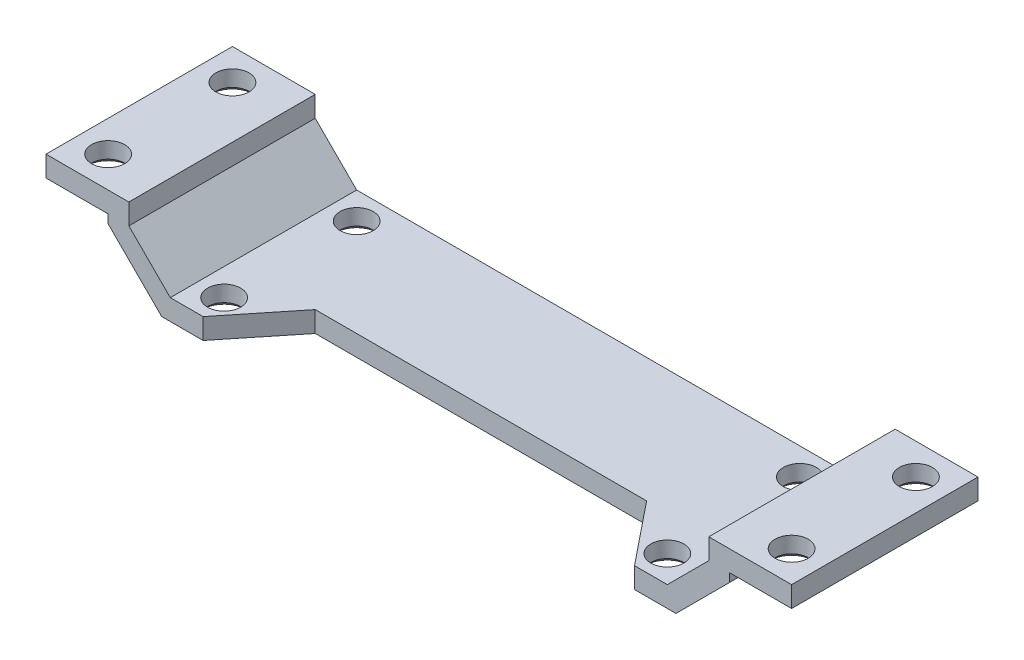
ISO-10303-21;
HEADER;
FILE_DESCRIPTION(('STEP AP214'),'2;1');
FILE_NAME('part.step','',(''),(''),'','','');
FILE_SCHEMA(('AUTOMOTIVE_DESIGN { 1 0 10303 214 1 1 1 1 }'));
ENDSEC;
DATA;
#1=APPLICATION_CONTEXT('core data for automotive mechanical design processes');
#2=APPLICATION_PROTOCOL_DEFINITION('international standard','automotive_design',2000,#1);
#3=PRODUCT_CONTEXT('',#1,'mechanical');
#4=PRODUCT('Part','Part','',(#3));
#5=PRODUCT_RELATED_PRODUCT_CATEGORY('part','',(#4));
#6=PRODUCT_DEFINITION_FORMATION('','',#4);
#7=PRODUCT_DEFINITION_CONTEXT('part definition',#1,'design');
#8=PRODUCT_DEFINITION('design','',#6,#7);
#9=PRODUCT_DEFINITION_SHAPE('','',#8);
#10=(LENGTH_UNIT() NAMED_UNIT(*) SI_UNIT(.MILLI.,.METRE.));
#11=(NAMED_UNIT(*) PLANE_ANGLE_UNIT() SI_UNIT($,.RADIAN.));
#12=(NAMED_UNIT(*) SI_UNIT($,.STERADIAN.) SOLID_ANGLE_UNIT());
#13=UNCERTAINTY_MEASURE_WITH_UNIT(LENGTH_MEASURE(1.E-05),#10,'distance_accuracy_value','');
#14=(GEOMETRIC_REPRESENTATION_CONTEXT(3) GLOBAL_UNCERTAINTY_ASSIGNED_CONTEXT((#13)) GLOBAL_UNIT_ASSIGNED_CONTEXT((#10,
#11,#12)) REPRESENTATION_CONTEXT('',''));
#15=CARTESIAN_POINT('',(0.,0.,0.));
#16=DIRECTION('',(0.,0.,1.));
#17=DIRECTION('',(1.,0.,0.));
#18=AXIS2_PLACEMENT_3D('',#15,#16,#17);
#19=CARTESIAN_POINT('',(-12.4142135623731,-1.,9.));
#20=DIRECTION('',(0.,1.,0.));
#21=DIRECTION('',(0.,0.,1.));
#22=AXIS2_PLACEMENT_3D('',#19,#20,#21);
#23=PLANE('',#22);
#24=CARTESIAN_POINT('',(-10.7,-1.,1.3));
#25=DIRECTION('',(0.,-1.,0.));
#26=DIRECTION('',(0.,0.,-1.));
#27=AXIS2_PLACEMENT_3D('',#24,#25,#26);
#28=CIRCLE('',#27,1.025);
#29=CARTESIAN_POINT('',(-10.7,-1.,0.275000000000001));
#30=VERTEX_POINT('',#29);
#31=EDGE_CURVE('E757',#30,#30,#28,.T.);
#32=ORIENTED_EDGE('',*,*,#31,.F.);
#33=EDGE_LOOP('',(#32));
#34=FACE_BOUND('',#33,.T.);
#35=CARTESIAN_POINT('',(10.7,-1.,7.7));
#36=DIRECTION('',(0.,-1.,0.));
#37=DIRECTION('',(0.,0.,-1.));
#38=AXIS2_PLACEMENT_3D('',#35,#36,#37);
#39=CIRCLE('',#38,1.025);
#40=CARTESIAN_POINT('',(10.7,-1.,6.675));
#41=VERTEX_POINT('',#40);
#42=EDGE_CURVE('E775',#41,#41,#39,.T.);
#43=ORIENTED_EDGE('',*,*,#42,.F.);
#44=EDGE_LOOP('',(#43));
#45=FACE_BOUND('',#44,.T.);
#46=DIRECTION('',(1.,0.,0.));
#47=VECTOR('',#46,1.);
#48=CARTESIAN_POINT('',(-12.4142135623731,-1.,9.));
#49=LINE('',#48,#47);
#50=CARTESIAN_POINT('',(10.4142135623731,-1.,9.));
#51=VERTEX_POINT('',#50);
#52=CARTESIAN_POINT('',(12.4142135623731,-1.,9.));
#53=VERTEX_POINT('',#52);
#54=EDGE_CURVE('E273',#51,#53,#49,.T.);
#55=ORIENTED_EDGE('',*,*,#54,.F.);
#56=DIRECTION('',(0.62694312132195,0.,0.779065031064218));
#57=VECTOR('',#56,1.);
#58=CARTESIAN_POINT('',(8.,-1.,6.));
#59=LINE('',#58,#57);
#60=CARTESIAN_POINT('',(8.,-1.,6.));
#61=VERTEX_POINT('',#60);
#62=EDGE_CURVE('E286',#61,#51,#59,.T.);
#63=ORIENTED_EDGE('',*,*,#62,.F.);
#64=DIRECTION('',(1.,0.,0.));
#65=VECTOR('',#64,1.);
#66=CARTESIAN_POINT('',(-8.,-1.,6.));
#67=LINE('',#66,#65);
#68=CARTESIAN_POINT('',(-8.,-1.,6.));
#69=VERTEX_POINT('',#68);
#70=EDGE_CURVE('E821',#69,#61,#67,.T.);
#71=ORIENTED_EDGE('',*,*,#70,.F.);
#72=DIRECTION('',(0.626943121321951,0.,-0.779065031064218));
#73=VECTOR('',#72,1.);
#74=CARTESIAN_POINT('',(-10.4142135623731,-1.,9.));
#75=LINE('',#74,#73);
#76=CARTESIAN_POINT('',(-10.4142135623731,-1.,9.));
#77=VERTEX_POINT('',#76);
#78=EDGE_CURVE('E351',#77,#69,#75,.T.);
#79=ORIENTED_EDGE('',*,*,#78,.F.);
#80=CARTESIAN_POINT('',(-12.4142135623731,-1.,9.));
#81=VERTEX_POINT('',#80);
#82=EDGE_CURVE('E288',#81,#77,#49,.T.);
#83=ORIENTED_EDGE('',*,*,#82,.F.);
#84=DIRECTION('',(0.,0.,-1.));
#85=VECTOR('',#84,1.);
#86=CARTESIAN_POINT('',(-12.4142135623731,-1.,9.));
#87=LINE('',#86,#85);
#88=CARTESIAN_POINT('',(-12.4142135623731,-1.,0.));
#89=VERTEX_POINT('',#88);
#90=EDGE_CURVE('E248',#81,#89,#87,.T.);
#91=ORIENTED_EDGE('',*,*,#90,.T.);
#92=DIRECTION('',(1.,0.,0.));
#93=VECTOR('',#92,1.);
#94=CARTESIAN_POINT('',(-12.4142135623731,-1.,0.));
#95=LINE('',#94,#93);
#96=CARTESIAN_POINT('',(12.4142135623731,-1.,0.));
#97=VERTEX_POINT('',#96);
#98=EDGE_CURVE('E213',#89,#97,#95,.T.);
#99=ORIENTED_EDGE('',*,*,#98,.T.);
#100=DIRECTION('',(0.,0.,-1.));
#101=VECTOR('',#100,1.);
#102=CARTESIAN_POINT('',(12.4142135623731,-1.,9.));
#103=LINE('',#102,#101);
#104=EDGE_CURVE('E245',#53,#97,#103,.T.);
#105=ORIENTED_EDGE('',*,*,#104,.F.);
#106=EDGE_LOOP('',(#55,#63,#71,#79,#83,#91,#99,#105));
#107=FACE_BOUND('',#106,.T.);
#108=CARTESIAN_POINT('',(10.7,-1.,1.3));
#109=DIRECTION('',(0.,-1.,0.));
#110=DIRECTION('',(0.,0.,-1.));
#111=AXIS2_PLACEMENT_3D('',#108,#109,#110);
#112=CIRCLE('',#111,1.025);
#113=CARTESIAN_POINT('',(10.7,-1.,0.275000000000004));
#114=VERTEX_POINT('',#113);
#115=EDGE_CURVE('E766',#114,#114,#112,.T.);
#116=ORIENTED_EDGE('',*,*,#115,.F.);
#117=EDGE_LOOP('',(#116));
#118=FACE_BOUND('',#117,.T.);
#119=CARTESIAN_POINT('',(-10.7,-1.,7.7));
#120=DIRECTION('',(0.,-1.,0.));
#121=DIRECTION('',(0.,0.,-1.));
#122=AXIS2_PLACEMENT_3D('',#119,#120,#121);
#123=CIRCLE('',#122,1.025);
#124=CARTESIAN_POINT('',(-10.7,-1.,6.675));
#125=VERTEX_POINT('',#124);
#126=EDGE_CURVE('E749',#125,#125,#123,.T.);
#127=ORIENTED_EDGE('',*,*,#126,.F.);
#128=EDGE_LOOP('',(#127));
#129=FACE_BOUND('',#128,.T.);
#130=ADVANCED_FACE('F36',(#34,#45,#107,#118,#129),#23,.F.);
#131=CARTESIAN_POINT('',(0.,0.,9.));
#132=DIRECTION('',(0.,0.,-1.));
#133=DIRECTION('',(-1.,0.,0.));
#134=AXIS2_PLACEMENT_3D('',#131,#132,#133);
#135=PLANE('',#134);
#136=DIRECTION('',(-1.,0.,0.));
#137=VECTOR('',#136,1.);
#138=CARTESIAN_POINT('',(-12.,0.,9.));
#139=LINE('',#138,#137);
#140=CARTESIAN_POINT('',(12.,0.,9.));
#141=VERTEX_POINT('',#140);
#142=CARTESIAN_POINT('',(10.4142135623731,0.,9.));
#143=VERTEX_POINT('',#142);
#144=EDGE_CURVE('E192',#141,#143,#139,.T.);
#145=ORIENTED_EDGE('',*,*,#144,.T.);
#146=DIRECTION('',(0.,-1.,0.));
#147=VECTOR('',#146,1.);
#148=CARTESIAN_POINT('',(10.4142135623731,0.,9.));
#149=LINE('',#148,#147);
#150=EDGE_CURVE('E44',#143,#51,#149,.T.);
#151=ORIENTED_EDGE('',*,*,#150,.T.);
#152=ORIENTED_EDGE('',*,*,#54,.T.);
#153=DIRECTION('',(0.707106781186548,0.707106781186547,0.));
#154=VECTOR('',#153,1.);
#155=CARTESIAN_POINT('',(12.4142135623731,-1.,9.));
#156=LINE('',#155,#154);
#157=CARTESIAN_POINT('',(15.,1.58578643762691,9.));
#158=VERTEX_POINT('',#157);
#159=EDGE_CURVE('E292',#53,#158,#156,.T.);
#160=ORIENTED_EDGE('',*,*,#159,.T.);
#161=DIRECTION('',(0.,1.,0.));
#162=VECTOR('',#161,1.);
#163=CARTESIAN_POINT('',(15.,1.58578643762691,9.));
#164=LINE('',#163,#162);
#165=CARTESIAN_POINT('',(15.,2.,9.));
#166=VERTEX_POINT('',#165);
#167=EDGE_CURVE('E298',#158,#166,#164,.T.);
#168=ORIENTED_EDGE('',*,*,#167,.T.);
#169=DIRECTION('',(1.,0.,0.));
#170=VECTOR('',#169,1.);
#171=CARTESIAN_POINT('',(15.,2.,9.));
#172=LINE('',#171,#170);
#173=CARTESIAN_POINT('',(18.,2.,9.));
#174=VERTEX_POINT('',#173);
#175=EDGE_CURVE('E300',#166,#174,#172,.T.);
#176=ORIENTED_EDGE('',*,*,#175,.T.);
#177=DIRECTION('',(0.,1.,0.));
#178=VECTOR('',#177,1.);
#179=CARTESIAN_POINT('',(18.,2.,9.));
#180=LINE('',#179,#178);
#181=CARTESIAN_POINT('',(18.,3.,9.));
#182=VERTEX_POINT('',#181);
#183=EDGE_CURVE('E302',#174,#182,#180,.T.);
#184=ORIENTED_EDGE('',*,*,#183,.T.);
#185=DIRECTION('',(-1.,0.,0.));
#186=VECTOR('',#185,1.);
#187=CARTESIAN_POINT('',(14.,3.,9.));
#188=LINE('',#187,#186);
#189=CARTESIAN_POINT('',(14.,3.,9.));
#190=VERTEX_POINT('',#189);
#191=EDGE_CURVE('E174',#182,#190,#188,.T.);
#192=ORIENTED_EDGE('',*,*,#191,.T.);
#193=DIRECTION('',(0.,-1.,0.));
#194=VECTOR('',#193,1.);
#195=CARTESIAN_POINT('',(14.,2.,9.));
#196=LINE('',#195,#194);
#197=CARTESIAN_POINT('',(14.,2.,9.));
#198=VERTEX_POINT('',#197);
#199=EDGE_CURVE('E166',#190,#198,#196,.T.);
#200=ORIENTED_EDGE('',*,*,#199,.T.);
#201=DIRECTION('',(-0.707106781186548,-0.707106781186547,0.));
#202=VECTOR('',#201,1.);
#203=CARTESIAN_POINT('',(12.,0.,9.));
#204=LINE('',#203,#202);
#205=EDGE_CURVE('E171',#198,#141,#204,.T.);
#206=ORIENTED_EDGE('',*,*,#205,.T.);
#207=EDGE_LOOP('',(#145,#151,#152,#160,#168,#176,#184,#192,#200,#206));
#208=FACE_BOUND('',#207,.T.);
#209=ADVANCED_FACE('F169',(#208),#135,.F.);
#210=CARTESIAN_POINT('',(-12.,0.,9.));
#211=DIRECTION('',(-0.707106781186548,-0.707106781186547,0.));
#212=DIRECTION('',(0.707106781186547,-0.707106781186548,0.));
#213=AXIS2_PLACEMENT_3D('',#210,#211,#212);
#214=PLANE('',#213);
#215=DIRECTION('',(-0.707106781186547,0.707106781186548,0.));
#216=VECTOR('',#215,1.);
#217=CARTESIAN_POINT('',(-12.,0.,0.));
#218=LINE('',#217,#216);
#219=CARTESIAN_POINT('',(-12.,0.,0.));
#220=VERTEX_POINT('',#219);
#221=CARTESIAN_POINT('',(-14.,2.,0.));
#222=VERTEX_POINT('',#221);
#223=EDGE_CURVE('E197',#220,#222,#218,.T.);
#224=ORIENTED_EDGE('',*,*,#223,.T.);
#225=DIRECTION('',(0.,0.,-1.));
#226=VECTOR('',#225,1.);
#227=CARTESIAN_POINT('',(-14.,2.,9.));
#228=LINE('',#227,#226);
#229=CARTESIAN_POINT('',(-14.,2.,9.));
#230=VERTEX_POINT('',#229);
#231=EDGE_CURVE('E266',#230,#222,#228,.T.);
#232=ORIENTED_EDGE('',*,*,#231,.F.);
#233=DIRECTION('',(-0.707106781186547,0.707106781186548,0.));
#234=VECTOR('',#233,1.);
#235=CARTESIAN_POINT('',(-12.,0.,9.));
#236=LINE('',#235,#234);
#237=CARTESIAN_POINT('',(-12.,0.,9.));
#238=VERTEX_POINT('',#237);
#239=EDGE_CURVE('E229',#238,#230,#236,.T.);
#240=ORIENTED_EDGE('',*,*,#239,.F.);
#241=DIRECTION('',(0.,0.,-1.));
#242=VECTOR('',#241,1.);
#243=CARTESIAN_POINT('',(-12.,0.,9.));
#244=LINE('',#243,#242);
#245=EDGE_CURVE('E196',#238,#220,#244,.T.);
#246=ORIENTED_EDGE('',*,*,#245,.T.);
#247=EDGE_LOOP('',(#224,#232,#240,#246));
#248=FACE_BOUND('',#247,.T.);
#249=ADVANCED_FACE('F38',(#248),#214,.F.);
#250=CARTESIAN_POINT('',(-14.,2.,9.));
#251=DIRECTION('',(-1.,0.,0.));
#252=DIRECTION('',(0.,0.,1.));
#253=AXIS2_PLACEMENT_3D('',#250,#251,#252);
#254=PLANE('',#253);
#255=DIRECTION('',(0.,1.,0.));
#256=VECTOR('',#255,1.);
#257=CARTESIAN_POINT('',(-14.,2.,0.));
#258=LINE('',#257,#256);
#259=CARTESIAN_POINT('',(-14.,3.,0.));
#260=VERTEX_POINT('',#259);
#261=EDGE_CURVE('E200',#222,#260,#258,.T.);
#262=ORIENTED_EDGE('',*,*,#261,.T.);
#263=DIRECTION('',(0.,0.,-1.));
#264=VECTOR('',#263,1.);
#265=CARTESIAN_POINT('',(-14.,3.,9.));
#266=LINE('',#265,#264);
#267=CARTESIAN_POINT('',(-14.,3.,9.));
#268=VERTEX_POINT('',#267);
#269=EDGE_CURVE('E263',#268,#260,#266,.T.);
#270=ORIENTED_EDGE('',*,*,#269,.F.);
#271=DIRECTION('',(0.,1.,0.));
#272=VECTOR('',#271,1.);
#273=CARTESIAN_POINT('',(-14.,2.,9.));
#274=LINE('',#273,#272);
#275=EDGE_CURVE('E126',#230,#268,#274,.T.);
#276=ORIENTED_EDGE('',*,*,#275,.F.);
#277=ORIENTED_EDGE('',*,*,#231,.T.);
#278=EDGE_LOOP('',(#262,#270,#276,#277));
#279=FACE_BOUND('',#278,.T.);
#280=ADVANCED_FACE('F368',(#279),#254,.F.);
#281=CARTESIAN_POINT('',(-14.,3.,9.));
#282=DIRECTION('',(0.,-1.,0.));
#283=DIRECTION('',(1.,0.,0.));
#284=AXIS2_PLACEMENT_3D('',#281,#282,#283);
#285=PLANE('',#284);
#286=CARTESIAN_POINT('',(-16.5,3.,7.5));
#287=DIRECTION('',(0.,-1.,0.));
#288=DIRECTION('',(1.,0.,0.));
#289=AXIS2_PLACEMENT_3D('',#286,#287,#288);
#290=CIRCLE('',#289,0.799999999999993);
#291=CARTESIAN_POINT('',(-15.7,3.,7.5));
#292=VERTEX_POINT('',#291);
#293=EDGE_CURVE('E790',#292,#292,#290,.T.);
#294=ORIENTED_EDGE('',*,*,#293,.T.);
#295=EDGE_LOOP('',(#294));
#296=FACE_BOUND('',#295,.T.);
#297=CARTESIAN_POINT('',(-16.5,3.,1.5));
#298=DIRECTION('',(0.,-1.,0.));
#299=DIRECTION('',(1.,0.,0.));
#300=AXIS2_PLACEMENT_3D('',#297,#298,#299);
#301=CIRCLE('',#300,0.799999999999993);
#302=CARTESIAN_POINT('',(-15.7,3.,1.5));
#303=VERTEX_POINT('',#302);
#304=EDGE_CURVE('E799',#303,#303,#301,.T.);
#305=ORIENTED_EDGE('',*,*,#304,.T.);
#306=EDGE_LOOP('',(#305));
#307=FACE_BOUND('',#306,.T.);
#308=DIRECTION('',(-1.,0.,0.));
#309=VECTOR('',#308,1.);
#310=CARTESIAN_POINT('',(-14.,3.,0.));
#311=LINE('',#310,#309);
#312=CARTESIAN_POINT('',(-18.,3.,0.));
#313=VERTEX_POINT('',#312);
#314=EDGE_CURVE('E203',#260,#313,#311,.T.);
#315=ORIENTED_EDGE('',*,*,#314,.T.);
#316=DIRECTION('',(0.,0.,-1.));
#317=VECTOR('',#316,1.);
#318=CARTESIAN_POINT('',(-18.,3.,9.));
#319=LINE('',#318,#317);
#320=CARTESIAN_POINT('',(-18.,3.,9.));
#321=VERTEX_POINT('',#320);
#322=EDGE_CURVE('E260',#321,#313,#319,.T.);
#323=ORIENTED_EDGE('',*,*,#322,.F.);
#324=DIRECTION('',(-1.,0.,0.));
#325=VECTOR('',#324,1.);
#326=CARTESIAN_POINT('',(-14.,3.,9.));
#327=LINE('',#326,#325);
#328=EDGE_CURVE('E328',#268,#321,#327,.T.);
#329=ORIENTED_EDGE('',*,*,#328,.F.);
#330=ORIENTED_EDGE('',*,*,#269,.T.);
#331=EDGE_LOOP('',(#315,#323,#329,#330));
#332=FACE_BOUND('',#331,.T.);
#333=ADVANCED_FACE('F371',(#296,#307,#332),#285,.F.);
#334=CARTESIAN_POINT('',(-18.,3.,9.));
#335=DIRECTION('',(1.,0.,0.));
#336=DIRECTION('',(0.,0.,-1.));
#337=AXIS2_PLACEMENT_3D('',#334,#335,#336);
#338=PLANE('',#337);
#339=DIRECTION('',(0.,-1.,0.));
#340=VECTOR('',#339,1.);
#341=CARTESIAN_POINT('',(-18.,3.,0.));
#342=LINE('',#341,#340);
#343=CARTESIAN_POINT('',(-18.,2.,0.));
#344=VERTEX_POINT('',#343);
#345=EDGE_CURVE('E205',#313,#344,#342,.T.);
#346=ORIENTED_EDGE('',*,*,#345,.T.);
#347=DIRECTION('',(0.,0.,-1.));
#348=VECTOR('',#347,1.);
#349=CARTESIAN_POINT('',(-18.,2.,9.));
#350=LINE('',#349,#348);
#351=CARTESIAN_POINT('',(-18.,2.,9.));
#352=VERTEX_POINT('',#351);
#353=EDGE_CURVE('E257',#352,#344,#350,.T.);
#354=ORIENTED_EDGE('',*,*,#353,.F.);
#355=DIRECTION('',(0.,-1.,0.));
#356=VECTOR('',#355,1.);
#357=CARTESIAN_POINT('',(-18.,3.,9.));
#358=LINE('',#357,#356);
#359=EDGE_CURVE('E330',#321,#352,#358,.T.);
#360=ORIENTED_EDGE('',*,*,#359,.F.);
#361=ORIENTED_EDGE('',*,*,#322,.T.);
#362=EDGE_LOOP('',(#346,#354,#360,#361));
#363=FACE_BOUND('',#362,.T.);
#364=ADVANCED_FACE('F376',(#363),#338,.F.);
#365=CARTESIAN_POINT('',(-15.,2.,9.));
#366=DIRECTION('',(0.,1.,0.));
#367=DIRECTION('',(-1.,0.,0.));
#368=AXIS2_PLACEMENT_3D('',#365,#366,#367);
#369=PLANE('',#368);
#370=CARTESIAN_POINT('',(-16.5,2.,7.5));
#371=DIRECTION('',(0.,-1.,0.));
#372=DIRECTION('',(0.,0.,-1.));
#373=AXIS2_PLACEMENT_3D('',#370,#371,#372);
#374=CIRCLE('',#373,1.025);
#375=CARTESIAN_POINT('',(-16.5,2.,6.475));
#376=VERTEX_POINT('',#375);
#377=EDGE_CURVE('E784',#376,#376,#374,.T.);
#378=ORIENTED_EDGE('',*,*,#377,.F.);
#379=EDGE_LOOP('',(#378));
#380=FACE_BOUND('',#379,.T.);
#381=CARTESIAN_POINT('',(-16.5,2.,1.5));
#382=DIRECTION('',(0.,-1.,0.));
#383=DIRECTION('',(0.,0.,-1.));
#384=AXIS2_PLACEMENT_3D('',#381,#382,#383);
#385=CIRCLE('',#384,1.025);
#386=CARTESIAN_POINT('',(-16.5,2.,0.475));
#387=VERTEX_POINT('',#386);
#388=EDGE_CURVE('E793',#387,#387,#385,.T.);
#389=ORIENTED_EDGE('',*,*,#388,.F.);
#390=EDGE_LOOP('',(#389));
#391=FACE_BOUND('',#390,.T.);
#392=DIRECTION('',(1.,0.,0.));
#393=VECTOR('',#392,1.);
#394=CARTESIAN_POINT('',(-15.,2.,0.));
#395=LINE('',#394,#393);
#396=CARTESIAN_POINT('',(-15.,2.,0.));
#397=VERTEX_POINT('',#396);
#398=EDGE_CURVE('E207',#344,#397,#395,.T.);
#399=ORIENTED_EDGE('',*,*,#398,.T.);
#400=DIRECTION('',(0.,0.,-1.));
#401=VECTOR('',#400,1.);
#402=CARTESIAN_POINT('',(-15.,2.,9.));
#403=LINE('',#402,#401);
#404=CARTESIAN_POINT('',(-15.,2.,9.));
#405=VERTEX_POINT('',#404);
#406=EDGE_CURVE('E254',#405,#397,#403,.T.);
#407=ORIENTED_EDGE('',*,*,#406,.F.);
#408=DIRECTION('',(1.,0.,0.));
#409=VECTOR('',#408,1.);
#410=CARTESIAN_POINT('',(-15.,2.,9.));
#411=LINE('',#410,#409);
#412=EDGE_CURVE('E332',#352,#405,#411,.T.);
#413=ORIENTED_EDGE('',*,*,#412,.F.);
#414=ORIENTED_EDGE('',*,*,#353,.T.);
#415=EDGE_LOOP('',(#399,#407,#413,#414));
#416=FACE_BOUND('',#415,.T.);
#417=ADVANCED_FACE('F379',(#380,#391,#416),#369,.F.);
#418=CARTESIAN_POINT('',(-15.,1.5857864376269,9.));
#419=DIRECTION('',(1.,0.,0.));
#420=DIRECTION('',(0.,0.,-1.));
#421=AXIS2_PLACEMENT_3D('',#418,#419,#420);
#422=PLANE('',#421);
#423=DIRECTION('',(0.,-1.,0.));
#424=VECTOR('',#423,1.);
#425=CARTESIAN_POINT('',(-15.,1.5857864376269,0.));
#426=LINE('',#425,#424);
#427=CARTESIAN_POINT('',(-15.,1.5857864376269,0.));
#428=VERTEX_POINT('',#427);
#429=EDGE_CURVE('E209',#397,#428,#426,.T.);
#430=ORIENTED_EDGE('',*,*,#429,.T.);
#431=DIRECTION('',(0.,0.,-1.));
#432=VECTOR('',#431,1.);
#433=CARTESIAN_POINT('',(-15.,1.5857864376269,9.));
#434=LINE('',#433,#432);
#435=CARTESIAN_POINT('',(-15.,1.5857864376269,9.));
#436=VERTEX_POINT('',#435);
#437=EDGE_CURVE('E251',#436,#428,#434,.T.);
#438=ORIENTED_EDGE('',*,*,#437,.F.);
#439=DIRECTION('',(0.,-1.,0.));
#440=VECTOR('',#439,1.);
#441=CARTESIAN_POINT('',(-15.,1.5857864376269,9.));
#442=LINE('',#441,#440);
#443=EDGE_CURVE('E293',#405,#436,#442,.T.);
#444=ORIENTED_EDGE('',*,*,#443,.F.);
#445=ORIENTED_EDGE('',*,*,#406,.T.);
#446=EDGE_LOOP('',(#430,#438,#444,#445));
#447=FACE_BOUND('',#446,.T.);
#448=ADVANCED_FACE('F341',(#447),#422,.F.);
#449=CARTESIAN_POINT('',(-12.4142135623731,-1.,9.));
#450=DIRECTION('',(0.707106781186548,0.707106781186547,0.));
#451=DIRECTION('',(-0.707106781186547,0.707106781186548,0.));
#452=AXIS2_PLACEMENT_3D('',#449,#450,#451);
#453=PLANE('',#452);
#454=DIRECTION('',(0.707106781186547,-0.707106781186548,0.));
#455=VECTOR('',#454,1.);
#456=CARTESIAN_POINT('',(-12.4142135623731,-1.,0.));
#457=LINE('',#456,#455);
#458=EDGE_CURVE('E211',#428,#89,#457,.T.);
#459=ORIENTED_EDGE('',*,*,#458,.T.);
#460=ORIENTED_EDGE('',*,*,#90,.F.);
#461=DIRECTION('',(0.707106781186547,-0.707106781186548,0.));
#462=VECTOR('',#461,1.);
#463=CARTESIAN_POINT('',(-12.4142135623731,-1.,9.));
#464=LINE('',#463,#462);
#465=EDGE_CURVE('E289',#436,#81,#464,.T.);
#466=ORIENTED_EDGE('',*,*,#465,.F.);
#467=ORIENTED_EDGE('',*,*,#437,.T.);
#468=EDGE_LOOP('',(#459,#460,#466,#467));
#469=FACE_BOUND('',#468,.T.);
#470=ADVANCED_FACE('F345',(#469),#453,.F.);
#471=CARTESIAN_POINT('',(12.4142135623731,-1.,9.));
#472=DIRECTION('',(-0.707106781186547,0.707106781186548,0.));
#473=DIRECTION('',(-0.707106781186548,-0.707106781186547,0.));
#474=AXIS2_PLACEMENT_3D('',#471,#472,#473);
#475=PLANE('',#474);
#476=DIRECTION('',(0.707106781186548,0.707106781186547,0.));
#477=VECTOR('',#476,1.);
#478=CARTESIAN_POINT('',(12.4142135623731,-1.,0.));
#479=LINE('',#478,#477);
#480=CARTESIAN_POINT('',(15.,1.58578643762691,0.));
#481=VERTEX_POINT('',#480);
#482=EDGE_CURVE('E215',#97,#481,#479,.T.);
#483=ORIENTED_EDGE('',*,*,#482,.T.);
#484=DIRECTION('',(0.,0.,-1.));
#485=VECTOR('',#484,1.);
#486=CARTESIAN_POINT('',(15.,1.58578643762691,9.));
#487=LINE('',#486,#485);
#488=EDGE_CURVE('E242',#158,#481,#487,.T.);
#489=ORIENTED_EDGE('',*,*,#488,.F.);
#490=ORIENTED_EDGE('',*,*,#159,.F.);
#491=ORIENTED_EDGE('',*,*,#104,.T.);
#492=EDGE_LOOP('',(#483,#489,#490,#491));
#493=FACE_BOUND('',#492,.T.);
#494=ADVANCED_FACE('F383',(#493),#475,.F.);
#495=CARTESIAN_POINT('',(15.,1.58578643762691,9.));
#496=DIRECTION('',(-1.,0.,0.));
#497=DIRECTION('',(0.,0.,1.));
#498=AXIS2_PLACEMENT_3D('',#495,#496,#497);
#499=PLANE('',#498);
#500=DIRECTION('',(0.,1.,0.));
#501=VECTOR('',#500,1.);
#502=CARTESIAN_POINT('',(15.,1.58578643762691,0.));
#503=LINE('',#502,#501);
#504=CARTESIAN_POINT('',(15.,2.,0.));
#505=VERTEX_POINT('',#504);
#506=EDGE_CURVE('E217',#481,#505,#503,.T.);
#507=ORIENTED_EDGE('',*,*,#506,.T.);
#508=DIRECTION('',(0.,0.,-1.));
#509=VECTOR('',#508,1.);
#510=CARTESIAN_POINT('',(15.,2.,9.));
#511=LINE('',#510,#509);
#512=EDGE_CURVE('E239',#166,#505,#511,.T.);
#513=ORIENTED_EDGE('',*,*,#512,.F.);
#514=ORIENTED_EDGE('',*,*,#167,.F.);
#515=ORIENTED_EDGE('',*,*,#488,.T.);
#516=EDGE_LOOP('',(#507,#513,#514,#515));
#517=FACE_BOUND('',#516,.T.);
#518=ADVANCED_FACE('F388',(#517),#499,.F.);
#519=CARTESIAN_POINT('',(15.,2.,9.));
#520=DIRECTION('',(0.,1.,0.));
#521=DIRECTION('',(0.,0.,1.));
#522=AXIS2_PLACEMENT_3D('',#519,#520,#521);
#523=PLANE('',#522);
#524=CARTESIAN_POINT('',(16.5,2.,7.5));
#525=DIRECTION('',(0.,-1.,0.));
#526=DIRECTION('',(0.,0.,-1.));
#527=AXIS2_PLACEMENT_3D('',#524,#525,#526);
#528=CIRCLE('',#527,1.025);
#529=CARTESIAN_POINT('',(16.5,2.,6.475));
#530=VERTEX_POINT('',#529);
#531=EDGE_CURVE('E802',#530,#530,#528,.T.);
#532=ORIENTED_EDGE('',*,*,#531,.F.);
#533=EDGE_LOOP('',(#532));
#534=FACE_BOUND('',#533,.T.);
#535=CARTESIAN_POINT('',(16.5,2.,1.5));
#536=DIRECTION('',(0.,-1.,0.));
#537=DIRECTION('',(0.,0.,-1.));
#538=AXIS2_PLACEMENT_3D('',#535,#536,#537);
#539=CIRCLE('',#538,1.025);
#540=CARTESIAN_POINT('',(16.5,2.,0.474999999999998));
#541=VERTEX_POINT('',#540);
#542=EDGE_CURVE('E811',#541,#541,#539,.T.);
#543=ORIENTED_EDGE('',*,*,#542,.F.);
#544=EDGE_LOOP('',(#543));
#545=FACE_BOUND('',#544,.T.);
#546=DIRECTION('',(1.,0.,0.));
#547=VECTOR('',#546,1.);
#548=CARTESIAN_POINT('',(15.,2.,0.));
#549=LINE('',#548,#547);
#550=CARTESIAN_POINT('',(18.,2.,0.));
#551=VERTEX_POINT('',#550);
#552=EDGE_CURVE('E219',#505,#551,#549,.T.);
#553=ORIENTED_EDGE('',*,*,#552,.T.);
#554=DIRECTION('',(0.,0.,-1.));
#555=VECTOR('',#554,1.);
#556=CARTESIAN_POINT('',(18.,2.,9.));
#557=LINE('',#556,#555);
#558=EDGE_CURVE('E236',#174,#551,#557,.T.);
#559=ORIENTED_EDGE('',*,*,#558,.F.);
#560=ORIENTED_EDGE('',*,*,#175,.F.);
#561=ORIENTED_EDGE('',*,*,#512,.T.);
#562=EDGE_LOOP('',(#553,#559,#560,#561));
#563=FACE_BOUND('',#562,.T.);
#564=ADVANCED_FACE('F391',(#534,#545,#563),#523,.F.);
#565=CARTESIAN_POINT('',(18.,2.,9.));
#566=DIRECTION('',(-1.,0.,0.));
#567=DIRECTION('',(0.,0.,1.));
#568=AXIS2_PLACEMENT_3D('',#565,#566,#567);
#569=PLANE('',#568);
#570=DIRECTION('',(0.,1.,0.));
#571=VECTOR('',#570,1.);
#572=CARTESIAN_POINT('',(18.,2.,0.));
#573=LINE('',#572,#571);
#574=CARTESIAN_POINT('',(18.,3.,0.));
#575=VERTEX_POINT('',#574);
#576=EDGE_CURVE('E221',#551,#575,#573,.T.);
#577=ORIENTED_EDGE('',*,*,#576,.T.);
#578=DIRECTION('',(0.,0.,-1.));
#579=VECTOR('',#578,1.);
#580=CARTESIAN_POINT('',(18.,3.,9.));
#581=LINE('',#580,#579);
#582=EDGE_CURVE('E233',#182,#575,#581,.T.);
#583=ORIENTED_EDGE('',*,*,#582,.F.);
#584=ORIENTED_EDGE('',*,*,#183,.F.);
#585=ORIENTED_EDGE('',*,*,#558,.T.);
#586=EDGE_LOOP('',(#577,#583,#584,#585));
#587=FACE_BOUND('',#586,.T.);
#588=ADVANCED_FACE('F308',(#587),#569,.F.);
#589=CARTESIAN_POINT('',(14.,3.,9.));
#590=DIRECTION('',(0.,-1.,0.));
#591=DIRECTION('',(0.,0.,-1.));
#592=AXIS2_PLACEMENT_3D('',#589,#590,#591);
#593=PLANE('',#592);
#594=CARTESIAN_POINT('',(16.5,3.,7.5));
#595=DIRECTION('',(0.,-1.,0.));
#596=DIRECTION('',(0.,0.,-1.));
#597=AXIS2_PLACEMENT_3D('',#594,#595,#596);
#598=CIRCLE('',#597,0.799999999999993);
#599=CARTESIAN_POINT('',(16.5,3.,6.70000000000001));
#600=VERTEX_POINT('',#599);
#601=EDGE_CURVE('E808',#600,#600,#598,.T.);
#602=ORIENTED_EDGE('',*,*,#601,.T.);
#603=EDGE_LOOP('',(#602));
#604=FACE_BOUND('',#603,.T.);
#605=CARTESIAN_POINT('',(16.5,3.,1.5));
#606=DIRECTION('',(0.,-1.,0.));
#607=DIRECTION('',(0.,0.,-1.));
#608=AXIS2_PLACEMENT_3D('',#605,#606,#607);
#609=CIRCLE('',#608,0.799999999999993);
#610=CARTESIAN_POINT('',(16.5,3.,0.700000000000007));
#611=VERTEX_POINT('',#610);
#612=EDGE_CURVE('E817',#611,#611,#609,.T.);
#613=ORIENTED_EDGE('',*,*,#612,.T.);
#614=EDGE_LOOP('',(#613));
#615=FACE_BOUND('',#614,.T.);
#616=DIRECTION('',(-1.,0.,0.));
#617=VECTOR('',#616,1.);
#618=CARTESIAN_POINT('',(14.,3.,0.));
#619=LINE('',#618,#617);
#620=CARTESIAN_POINT('',(14.,3.,0.));
#621=VERTEX_POINT('',#620);
#622=EDGE_CURVE('E223',#575,#621,#619,.T.);
#623=ORIENTED_EDGE('',*,*,#622,.T.);
#624=DIRECTION('',(0.,0.,-1.));
#625=VECTOR('',#624,1.);
#626=CARTESIAN_POINT('',(14.,3.,9.));
#627=LINE('',#626,#625);
#628=EDGE_CURVE('E186',#190,#621,#627,.T.);
#629=ORIENTED_EDGE('',*,*,#628,.F.);
#630=ORIENTED_EDGE('',*,*,#191,.F.);
#631=ORIENTED_EDGE('',*,*,#582,.T.);
#632=EDGE_LOOP('',(#623,#629,#630,#631));
#633=FACE_BOUND('',#632,.T.);
#634=ADVANCED_FACE('F312',(#604,#615,#633),#593,.F.);
#635=CARTESIAN_POINT('',(14.,2.,9.));
#636=DIRECTION('',(1.,0.,0.));
#637=DIRECTION('',(0.,0.,-1.));
#638=AXIS2_PLACEMENT_3D('',#635,#636,#637);
#639=PLANE('',#638);
#640=DIRECTION('',(0.,-1.,0.));
#641=VECTOR('',#640,1.);
#642=CARTESIAN_POINT('',(14.,2.,0.));
#643=LINE('',#642,#641);
#644=CARTESIAN_POINT('',(14.,2.,0.));
#645=VERTEX_POINT('',#644);
#646=EDGE_CURVE('E183',#621,#645,#643,.T.);
#647=ORIENTED_EDGE('',*,*,#646,.T.);
#648=DIRECTION('',(0.,0.,-1.));
#649=VECTOR('',#648,1.);
#650=CARTESIAN_POINT('',(14.,2.,9.));
#651=LINE('',#650,#649);
#652=EDGE_CURVE('E180',#198,#645,#651,.T.);
#653=ORIENTED_EDGE('',*,*,#652,.F.);
#654=ORIENTED_EDGE('',*,*,#199,.F.);
#655=ORIENTED_EDGE('',*,*,#628,.T.);
#656=EDGE_LOOP('',(#647,#653,#654,#655));
#657=FACE_BOUND('',#656,.T.);
#658=ADVANCED_FACE('F181',(#657),#639,.F.);
#659=CARTESIAN_POINT('',(12.,0.,9.));
#660=DIRECTION('',(0.707106781186547,-0.707106781186548,0.));
#661=DIRECTION('',(0.707106781186548,0.707106781186547,0.));
#662=AXIS2_PLACEMENT_3D('',#659,#660,#661);
#663=PLANE('',#662);
#664=DIRECTION('',(-0.707106781186548,-0.707106781186547,0.));
#665=VECTOR('',#664,1.);
#666=CARTESIAN_POINT('',(12.,0.,0.));
#667=LINE('',#666,#665);
#668=CARTESIAN_POINT('',(12.,0.,0.));
#669=VERTEX_POINT('',#668);
#670=EDGE_CURVE('E226',#645,#669,#667,.T.);
#671=ORIENTED_EDGE('',*,*,#670,.T.);
#672=DIRECTION('',(0.,0.,-1.));
#673=VECTOR('',#672,1.);
#674=CARTESIAN_POINT('',(12.,0.,9.));
#675=LINE('',#674,#673);
#676=EDGE_CURVE('E187',#141,#669,#675,.T.);
#677=ORIENTED_EDGE('',*,*,#676,.F.);
#678=ORIENTED_EDGE('',*,*,#205,.F.);
#679=ORIENTED_EDGE('',*,*,#652,.T.);
#680=EDGE_LOOP('',(#671,#677,#678,#679));
#681=FACE_BOUND('',#680,.T.);
#682=ADVANCED_FACE('F189',(#681),#663,.F.);
#683=CARTESIAN_POINT('',(-12.,0.,9.));
#684=DIRECTION('',(0.,-1.,0.));
#685=DIRECTION('',(0.,0.,-1.));
#686=AXIS2_PLACEMENT_3D('',#683,#684,#685);
#687=PLANE('',#686);
#688=CARTESIAN_POINT('',(-10.7,0.,7.7));
#689=DIRECTION('',(0.,-1.,0.));
#690=DIRECTION('',(0.,0.,-1.));
#691=AXIS2_PLACEMENT_3D('',#688,#689,#690);
#692=CIRCLE('',#691,0.799999999999994);
#693=CARTESIAN_POINT('',(-10.7,0.,6.90000000000001));
#694=VERTEX_POINT('',#693);
#695=EDGE_CURVE('E752',#694,#694,#692,.T.);
#696=ORIENTED_EDGE('',*,*,#695,.T.);
#697=EDGE_LOOP('',(#696));
#698=FACE_BOUND('',#697,.T.);
#699=CARTESIAN_POINT('',(-10.7,0.,1.3));
#700=DIRECTION('',(0.,-1.,0.));
#701=DIRECTION('',(0.,0.,-1.));
#702=AXIS2_PLACEMENT_3D('',#699,#700,#701);
#703=CIRCLE('',#702,0.799999999999994);
#704=CARTESIAN_POINT('',(-10.7,0.,0.500000000000007));
#705=VERTEX_POINT('',#704);
#706=EDGE_CURVE('E763',#705,#705,#703,.T.);
#707=ORIENTED_EDGE('',*,*,#706,.T.);
#708=EDGE_LOOP('',(#707));
#709=FACE_BOUND('',#708,.T.);
#710=CARTESIAN_POINT('',(10.7,0.,1.3));
#711=DIRECTION('',(0.,-1.,0.));
#712=DIRECTION('',(0.,0.,-1.));
#713=AXIS2_PLACEMENT_3D('',#710,#711,#712);
#714=CIRCLE('',#713,0.799999999999994);
#715=CARTESIAN_POINT('',(10.7,0.,0.500000000000009));
#716=VERTEX_POINT('',#715);
#717=EDGE_CURVE('E772',#716,#716,#714,.T.);
#718=ORIENTED_EDGE('',*,*,#717,.T.);
#719=EDGE_LOOP('',(#718));
#720=FACE_BOUND('',#719,.T.);
#721=CARTESIAN_POINT('',(10.7,0.,7.7));
#722=DIRECTION('',(0.,-1.,0.));
#723=DIRECTION('',(0.,0.,-1.));
#724=AXIS2_PLACEMENT_3D('',#721,#722,#723);
#725=CIRCLE('',#724,0.799999999999994);
#726=CARTESIAN_POINT('',(10.7,0.,6.90000000000001));
#727=VERTEX_POINT('',#726);
#728=EDGE_CURVE('E781',#727,#727,#725,.T.);
#729=ORIENTED_EDGE('',*,*,#728,.T.);
#730=EDGE_LOOP('',(#729));
#731=FACE_BOUND('',#730,.T.);
#732=DIRECTION('',(1.,0.,0.));
#733=VECTOR('',#732,1.);
#734=CARTESIAN_POINT('',(-12.,0.,6.));
#735=LINE('',#734,#733);
#736=CARTESIAN_POINT('',(-8.,0.,6.));
#737=VERTEX_POINT('',#736);
#738=CARTESIAN_POINT('',(8.,0.,6.));
#739=VERTEX_POINT('',#738);
#740=EDGE_CURVE('E11',#737,#739,#735,.T.);
#741=ORIENTED_EDGE('',*,*,#740,.T.);
#742=DIRECTION('',(0.62694312132195,0.,0.779065031064218));
#743=VECTOR('',#742,1.);
#744=CARTESIAN_POINT('',(1.60413483940636,0.,-1.94776227788238));
#745=LINE('',#744,#743);
#746=EDGE_CURVE('E201',#739,#143,#745,.T.);
#747=ORIENTED_EDGE('',*,*,#746,.T.);
#748=ORIENTED_EDGE('',*,*,#144,.F.);
#749=ORIENTED_EDGE('',*,*,#676,.T.);
#750=DIRECTION('',(-1.,0.,0.));
#751=VECTOR('',#750,1.);
#752=CARTESIAN_POINT('',(-12.,0.,0.));
#753=LINE('',#752,#751);
#754=EDGE_CURVE('E117',#669,#220,#753,.T.);
#755=ORIENTED_EDGE('',*,*,#754,.T.);
#756=ORIENTED_EDGE('',*,*,#245,.F.);
#757=CARTESIAN_POINT('',(-10.4142135623731,0.,9.));
#758=VERTEX_POINT('',#757);
#759=EDGE_CURVE('E59',#758,#238,#139,.T.);
#760=ORIENTED_EDGE('',*,*,#759,.F.);
#761=DIRECTION('',(0.626943121321951,0.,-0.779065031064218));
#762=VECTOR('',#761,1.);
#763=CARTESIAN_POINT('',(-11.0375190963562,0.,9.774544817034));
#764=LINE('',#763,#762);
#765=EDGE_CURVE('E51',#758,#737,#764,.T.);
#766=ORIENTED_EDGE('',*,*,#765,.T.);
#767=EDGE_LOOP('',(#741,#747,#748,#749,#755,#756,#760,#766));
#768=FACE_BOUND('',#767,.T.);
#769=ADVANCED_FACE('F316',(#698,#709,#720,#731,#768),#687,.F.);
#770=ORIENTED_EDGE('',*,*,#82,.T.);
#771=DIRECTION('',(0.,1.,0.));
#772=VECTOR('',#771,1.);
#773=CARTESIAN_POINT('',(-10.4142135623731,0.,9.));
#774=LINE('',#773,#772);
#775=EDGE_CURVE('E268',#77,#758,#774,.T.);
#776=ORIENTED_EDGE('',*,*,#775,.T.);
#777=ORIENTED_EDGE('',*,*,#759,.T.);
#778=ORIENTED_EDGE('',*,*,#239,.T.);
#779=ORIENTED_EDGE('',*,*,#275,.T.);
#780=ORIENTED_EDGE('',*,*,#328,.T.);
#781=ORIENTED_EDGE('',*,*,#359,.T.);
#782=ORIENTED_EDGE('',*,*,#412,.T.);
#783=ORIENTED_EDGE('',*,*,#443,.T.);
#784=ORIENTED_EDGE('',*,*,#465,.T.);
#785=EDGE_LOOP('',(#770,#776,#777,#778,#779,#780,#781,#782,#783,#784));
#786=FACE_BOUND('',#785,.T.);
#787=ADVANCED_FACE('F335',(#786),#135,.F.);
#788=CARTESIAN_POINT('',(0.,0.,0.));
#789=DIRECTION('',(0.,0.,-1.));
#790=DIRECTION('',(-1.,0.,0.));
#791=AXIS2_PLACEMENT_3D('',#788,#789,#790);
#792=PLANE('',#791);
#793=ORIENTED_EDGE('',*,*,#223,.F.);
#794=ORIENTED_EDGE('',*,*,#754,.F.);
#795=ORIENTED_EDGE('',*,*,#670,.F.);
#796=ORIENTED_EDGE('',*,*,#646,.F.);
#797=ORIENTED_EDGE('',*,*,#622,.F.);
#798=ORIENTED_EDGE('',*,*,#576,.F.);
#799=ORIENTED_EDGE('',*,*,#552,.F.);
#800=ORIENTED_EDGE('',*,*,#506,.F.);
#801=ORIENTED_EDGE('',*,*,#482,.F.);
#802=ORIENTED_EDGE('',*,*,#98,.F.);
#803=ORIENTED_EDGE('',*,*,#458,.F.);
#804=ORIENTED_EDGE('',*,*,#429,.F.);
#805=ORIENTED_EDGE('',*,*,#398,.F.);
#806=ORIENTED_EDGE('',*,*,#345,.F.);
#807=ORIENTED_EDGE('',*,*,#314,.F.);
#808=ORIENTED_EDGE('',*,*,#261,.F.);
#809=EDGE_LOOP('',(#793,#794,#795,#796,#797,#798,#799,#800,#801,#802,#803,#804,#805,#806,#807,#808));
#810=FACE_BOUND('',#809,.T.);
#811=ADVANCED_FACE('F315',(#810),#792,.T.);
#812=CARTESIAN_POINT('',(-8.,3.,6.));
#813=DIRECTION('',(0.,0.,-1.));
#814=DIRECTION('',(-1.,0.,0.));
#815=AXIS2_PLACEMENT_3D('',#812,#813,#814);
#816=PLANE('',#815);
#817=DIRECTION('',(0.,-1.,0.));
#818=VECTOR('',#817,1.);
#819=CARTESIAN_POINT('',(-8.,3.,6.));
#820=LINE('',#819,#818);
#821=EDGE_CURVE('E361',#737,#69,#820,.T.);
#822=ORIENTED_EDGE('',*,*,#821,.T.);
#823=ORIENTED_EDGE('',*,*,#70,.T.);
#824=DIRECTION('',(0.,-1.,0.));
#825=VECTOR('',#824,1.);
#826=CARTESIAN_POINT('',(8.,3.,6.));
#827=LINE('',#826,#825);
#828=EDGE_CURVE('E322',#739,#61,#827,.T.);
#829=ORIENTED_EDGE('',*,*,#828,.F.);
#830=ORIENTED_EDGE('',*,*,#740,.F.);
#831=EDGE_LOOP('',(#822,#823,#829,#830));
#832=FACE_BOUND('',#831,.T.);
#833=ADVANCED_FACE('F359',(#832),#816,.F.);
#834=CARTESIAN_POINT('',(8.,3.,6.));
#835=DIRECTION('',(0.779065031064218,0.,-0.62694312132195));
#836=DIRECTION('',(-0.62694312132195,0.,-0.779065031064218));
#837=AXIS2_PLACEMENT_3D('',#834,#835,#836);
#838=PLANE('',#837);
#839=ORIENTED_EDGE('',*,*,#828,.T.);
#840=ORIENTED_EDGE('',*,*,#62,.T.);
#841=ORIENTED_EDGE('',*,*,#150,.F.);
#842=ORIENTED_EDGE('',*,*,#746,.F.);
#843=EDGE_LOOP('',(#839,#840,#841,#842));
#844=FACE_BOUND('',#843,.T.);
#845=ADVANCED_FACE('F458',(#844),#838,.F.);
#846=CARTESIAN_POINT('',(-10.4142135623731,3.,9.));
#847=DIRECTION('',(-0.779065031064218,0.,-0.626943121321951));
#848=DIRECTION('',(-0.626943121321951,0.,0.779065031064218));
#849=AXIS2_PLACEMENT_3D('',#846,#847,#848);
#850=PLANE('',#849);
#851=ORIENTED_EDGE('',*,*,#775,.F.);
#852=ORIENTED_EDGE('',*,*,#78,.T.);
#853=ORIENTED_EDGE('',*,*,#821,.F.);
#854=ORIENTED_EDGE('',*,*,#765,.F.);
#855=EDGE_LOOP('',(#851,#852,#853,#854));
#856=FACE_BOUND('',#855,.T.);
#857=ADVANCED_FACE('F362',(#856),#850,.F.);
#858=CARTESIAN_POINT('',(16.5,2.,1.5));
#859=DIRECTION('',(0.,-1.,0.));
#860=DIRECTION('',(0.,0.,-1.));
#861=AXIS2_PLACEMENT_3D('',#858,#859,#860);
#862=CYLINDRICAL_SURFACE('',#861,0.799999999999993);
#863=ORIENTED_EDGE('',*,*,#612,.F.);
#864=EDGE_LOOP('',(#863));
#865=FACE_BOUND('',#864,.T.);
#866=CARTESIAN_POINT('',(16.5,2.22500000000001,1.5));
#867=DIRECTION('',(0.,-1.,0.));
#868=DIRECTION('',(0.,0.,-1.));
#869=AXIS2_PLACEMENT_3D('',#866,#867,#868);
#870=CIRCLE('',#869,0.799999999999988);
#871=CARTESIAN_POINT('',(16.5,2.22500000000001,0.700000000000012));
#872=VERTEX_POINT('',#871);
#873=EDGE_CURVE('E814',#872,#872,#870,.T.);
#874=ORIENTED_EDGE('',*,*,#873,.T.);
#875=EDGE_LOOP('',(#874));
#876=FACE_BOUND('',#875,.T.);
#877=ADVANCED_FACE('F475',(#865,#876),#862,.F.);
#878=CARTESIAN_POINT('',(16.5,2.,1.5));
#879=DIRECTION('',(0.,-1.,0.));
#880=DIRECTION('',(0.,0.,-1.));
#881=AXIS2_PLACEMENT_3D('',#878,#879,#880);
#882=CONICAL_SURFACE('',#881,1.025,0.785398163397468);
#883=ORIENTED_EDGE('',*,*,#873,.F.);
#884=EDGE_LOOP('',(#883));
#885=FACE_BOUND('',#884,.T.);
#886=ORIENTED_EDGE('',*,*,#542,.T.);
#887=EDGE_LOOP('',(#886));
#888=FACE_BOUND('',#887,.T.);
#889=ADVANCED_FACE('F517',(#885,#888),#882,.F.);
#890=CARTESIAN_POINT('',(16.5,2.,7.5));
#891=DIRECTION('',(0.,-1.,0.));
#892=DIRECTION('',(0.,0.,-1.));
#893=AXIS2_PLACEMENT_3D('',#890,#891,#892);
#894=CYLINDRICAL_SURFACE('',#893,0.799999999999993);
#895=ORIENTED_EDGE('',*,*,#601,.F.);
#896=EDGE_LOOP('',(#895));
#897=FACE_BOUND('',#896,.T.);
#898=CARTESIAN_POINT('',(16.5,2.22500000000001,7.5));
#899=DIRECTION('',(0.,-1.,0.));
#900=DIRECTION('',(0.,0.,-1.));
#901=AXIS2_PLACEMENT_3D('',#898,#899,#900);
#902=CIRCLE('',#901,0.799999999999988);
#903=CARTESIAN_POINT('',(16.5,2.22500000000001,6.70000000000001));
#904=VERTEX_POINT('',#903);
#905=EDGE_CURVE('E805',#904,#904,#902,.T.);
#906=ORIENTED_EDGE('',*,*,#905,.T.);
#907=EDGE_LOOP('',(#906));
#908=FACE_BOUND('',#907,.T.);
#909=ADVANCED_FACE('F529',(#897,#908),#894,.F.);
#910=CARTESIAN_POINT('',(16.5,2.,7.5));
#911=DIRECTION('',(0.,-1.,0.));
#912=DIRECTION('',(0.,0.,-1.));
#913=AXIS2_PLACEMENT_3D('',#910,#911,#912);
#914=CONICAL_SURFACE('',#913,1.025,0.785398163397468);
#915=ORIENTED_EDGE('',*,*,#905,.F.);
#916=EDGE_LOOP('',(#915));
#917=FACE_BOUND('',#916,.T.);
#918=ORIENTED_EDGE('',*,*,#531,.T.);
#919=EDGE_LOOP('',(#918));
#920=FACE_BOUND('',#919,.T.);
#921=ADVANCED_FACE('F539',(#917,#920),#914,.F.);
#922=CARTESIAN_POINT('',(-16.5,2.,1.5));
#923=DIRECTION('',(0.,-1.,0.));
#924=DIRECTION('',(0.,0.,-1.));
#925=AXIS2_PLACEMENT_3D('',#922,#923,#924);
#926=CYLINDRICAL_SURFACE('',#925,0.799999999999993);
#927=ORIENTED_EDGE('',*,*,#304,.F.);
#928=EDGE_LOOP('',(#927));
#929=FACE_BOUND('',#928,.T.);
#930=CARTESIAN_POINT('',(-16.5,2.225,1.5));
#931=DIRECTION('',(0.,-1.,0.));
#932=DIRECTION('',(0.,0.,-1.));
#933=AXIS2_PLACEMENT_3D('',#930,#931,#932);
#934=CIRCLE('',#933,0.799999999999988);
#935=CARTESIAN_POINT('',(-16.5,2.225,0.700000000000012));
#936=VERTEX_POINT('',#935);
#937=EDGE_CURVE('E796',#936,#936,#934,.T.);
#938=ORIENTED_EDGE('',*,*,#937,.T.);
#939=EDGE_LOOP('',(#938));
#940=FACE_BOUND('',#939,.T.);
#941=ADVANCED_FACE('F550',(#929,#940),#926,.F.);
#942=CARTESIAN_POINT('',(-16.5,2.,1.5));
#943=DIRECTION('',(0.,-1.,0.));
#944=DIRECTION('',(0.,0.,-1.));
#945=AXIS2_PLACEMENT_3D('',#942,#943,#944);
#946=CONICAL_SURFACE('',#945,1.025,0.785398163397464);
#947=ORIENTED_EDGE('',*,*,#937,.F.);
#948=EDGE_LOOP('',(#947));
#949=FACE_BOUND('',#948,.T.);
#950=ORIENTED_EDGE('',*,*,#388,.T.);
#951=EDGE_LOOP('',(#950));
#952=FACE_BOUND('',#951,.T.);
#953=ADVANCED_FACE('F560',(#949,#952),#946,.F.);
#954=CARTESIAN_POINT('',(-16.5,2.,7.5));
#955=DIRECTION('',(0.,-1.,0.));
#956=DIRECTION('',(0.,0.,-1.));
#957=AXIS2_PLACEMENT_3D('',#954,#955,#956);
#958=CYLINDRICAL_SURFACE('',#957,0.799999999999993);
#959=ORIENTED_EDGE('',*,*,#293,.F.);
#960=EDGE_LOOP('',(#959));
#961=FACE_BOUND('',#960,.T.);
#962=CARTESIAN_POINT('',(-16.5,2.225,7.5));
#963=DIRECTION('',(0.,-1.,0.));
#964=DIRECTION('',(0.,0.,-1.));
#965=AXIS2_PLACEMENT_3D('',#962,#963,#964);
#966=CIRCLE('',#965,0.799999999999988);
#967=CARTESIAN_POINT('',(-16.5,2.225,6.70000000000001));
#968=VERTEX_POINT('',#967);
#969=EDGE_CURVE('E787',#968,#968,#966,.T.);
#970=ORIENTED_EDGE('',*,*,#969,.T.);
#971=EDGE_LOOP('',(#970));
#972=FACE_BOUND('',#971,.T.);
#973=ADVANCED_FACE('F571',(#961,#972),#958,.F.);
#974=CARTESIAN_POINT('',(-16.5,2.,7.5));
#975=DIRECTION('',(0.,-1.,0.));
#976=DIRECTION('',(0.,0.,-1.));
#977=AXIS2_PLACEMENT_3D('',#974,#975,#976);
#978=CONICAL_SURFACE('',#977,1.025,0.785398163397464);
#979=ORIENTED_EDGE('',*,*,#969,.F.);
#980=EDGE_LOOP('',(#979));
#981=FACE_BOUND('',#980,.T.);
#982=ORIENTED_EDGE('',*,*,#377,.T.);
#983=EDGE_LOOP('',(#982));
#984=FACE_BOUND('',#983,.T.);
#985=ADVANCED_FACE('F581',(#981,#984),#978,.F.);
#986=CARTESIAN_POINT('',(10.7,-1.,7.7));
#987=DIRECTION('',(0.,-1.,0.));
#988=DIRECTION('',(0.,0.,-1.));
#989=AXIS2_PLACEMENT_3D('',#986,#987,#988);
#990=CYLINDRICAL_SURFACE('',#989,0.799999999999994);
#991=ORIENTED_EDGE('',*,*,#728,.F.);
#992=EDGE_LOOP('',(#991));
#993=FACE_BOUND('',#992,.T.);
#994=CARTESIAN_POINT('',(10.7,-0.774999999999997,7.7));
#995=DIRECTION('',(0.,-1.,0.));
#996=DIRECTION('',(0.,0.,-1.));
#997=AXIS2_PLACEMENT_3D('',#994,#995,#996);
#998=CIRCLE('',#997,0.799999999999988);
#999=CARTESIAN_POINT('',(10.7,-0.774999999999997,6.90000000000002));
#1000=VERTEX_POINT('',#999);
#1001=EDGE_CURVE('E778',#1000,#1000,#998,.T.);
#1002=ORIENTED_EDGE('',*,*,#1001,.T.);
#1003=EDGE_LOOP('',(#1002));
#1004=FACE_BOUND('',#1003,.T.);
#1005=ADVANCED_FACE('F590',(#993,#1004),#990,.F.);
#1006=CARTESIAN_POINT('',(10.7,-1.,7.7));
#1007=DIRECTION('',(0.,-1.,0.));
#1008=DIRECTION('',(0.,0.,-1.));
#1009=AXIS2_PLACEMENT_3D('',#1006,#1007,#1008);
#1010=CONICAL_SURFACE('',#1009,1.025,0.785398163397464);
#1011=ORIENTED_EDGE('',*,*,#1001,.F.);
#1012=EDGE_LOOP('',(#1011));
#1013=FACE_BOUND('',#1012,.T.);
#1014=ORIENTED_EDGE('',*,*,#42,.T.);
#1015=EDGE_LOOP('',(#1014));
#1016=FACE_BOUND('',#1015,.T.);
#1017=ADVANCED_FACE('F615',(#1013,#1016),#1010,.F.);
#1018=CARTESIAN_POINT('',(10.7,-1.,1.3));
#1019=DIRECTION('',(0.,-1.,0.));
#1020=DIRECTION('',(0.,0.,-1.));
#1021=AXIS2_PLACEMENT_3D('',#1018,#1019,#1020);
#1022=CYLINDRICAL_SURFACE('',#1021,0.799999999999994);
#1023=ORIENTED_EDGE('',*,*,#717,.F.);
#1024=EDGE_LOOP('',(#1023));
#1025=FACE_BOUND('',#1024,.T.);
#1026=CARTESIAN_POINT('',(10.7,-0.774999999999997,1.3));
#1027=DIRECTION('',(0.,-1.,0.));
#1028=DIRECTION('',(0.,0.,-1.));
#1029=AXIS2_PLACEMENT_3D('',#1026,#1027,#1028);
#1030=CIRCLE('',#1029,0.799999999999988);
#1031=CARTESIAN_POINT('',(10.7,-0.774999999999997,0.500000000000015));
#1032=VERTEX_POINT('',#1031);
#1033=EDGE_CURVE('E769',#1032,#1032,#1030,.T.);
#1034=ORIENTED_EDGE('',*,*,#1033,.T.);
#1035=EDGE_LOOP('',(#1034));
#1036=FACE_BOUND('',#1035,.T.);
#1037=ADVANCED_FACE('F626',(#1025,#1036),#1022,.F.);
#1038=CARTESIAN_POINT('',(10.7,-1.,1.3));
#1039=DIRECTION('',(0.,-1.,0.));
#1040=DIRECTION('',(0.,0.,-1.));
#1041=AXIS2_PLACEMENT_3D('',#1038,#1039,#1040);
#1042=CONICAL_SURFACE('',#1041,1.025,0.785398163397464);
#1043=ORIENTED_EDGE('',*,*,#1033,.F.);
#1044=EDGE_LOOP('',(#1043));
#1045=FACE_BOUND('',#1044,.T.);
#1046=ORIENTED_EDGE('',*,*,#115,.T.);
#1047=EDGE_LOOP('',(#1046));
#1048=FACE_BOUND('',#1047,.T.);
#1049=ADVANCED_FACE('F636',(#1045,#1048),#1042,.F.);
#1050=CARTESIAN_POINT('',(-10.7,-1.,1.3));
#1051=DIRECTION('',(0.,-1.,0.));
#1052=DIRECTION('',(0.,0.,-1.));
#1053=AXIS2_PLACEMENT_3D('',#1050,#1051,#1052);
#1054=CYLINDRICAL_SURFACE('',#1053,0.799999999999994);
#1055=ORIENTED_EDGE('',*,*,#706,.F.);
#1056=EDGE_LOOP('',(#1055));
#1057=FACE_BOUND('',#1056,.T.);
#1058=CARTESIAN_POINT('',(-10.7,-0.774999999999997,1.3));
#1059=DIRECTION('',(0.,-1.,0.));
#1060=DIRECTION('',(0.,0.,-1.));
#1061=AXIS2_PLACEMENT_3D('',#1058,#1059,#1060);
#1062=CIRCLE('',#1061,0.799999999999988);
#1063=CARTESIAN_POINT('',(-10.7,-0.774999999999997,0.500000000000013));
#1064=VERTEX_POINT('',#1063);
#1065=EDGE_CURVE('E760',#1064,#1064,#1062,.T.);
#1066=ORIENTED_EDGE('',*,*,#1065,.T.);
#1067=EDGE_LOOP('',(#1066));
#1068=FACE_BOUND('',#1067,.T.);
#1069=ADVANCED_FACE('F647',(#1057,#1068),#1054,.F.);
#1070=CARTESIAN_POINT('',(-10.7,-1.,1.3));
#1071=DIRECTION('',(0.,-1.,0.));
#1072=DIRECTION('',(0.,0.,-1.));
#1073=AXIS2_PLACEMENT_3D('',#1070,#1071,#1072);
#1074=CONICAL_SURFACE('',#1073,1.025,0.785398163397464);
#1075=ORIENTED_EDGE('',*,*,#1065,.F.);
#1076=EDGE_LOOP('',(#1075));
#1077=FACE_BOUND('',#1076,.T.);
#1078=ORIENTED_EDGE('',*,*,#31,.T.);
#1079=EDGE_LOOP('',(#1078));
#1080=FACE_BOUND('',#1079,.T.);
#1081=ADVANCED_FACE('F657',(#1077,#1080),#1074,.F.);
#1082=CARTESIAN_POINT('',(-10.7,-1.,7.7));
#1083=DIRECTION('',(0.,-1.,0.));
#1084=DIRECTION('',(0.,0.,-1.));
#1085=AXIS2_PLACEMENT_3D('',#1082,#1083,#1084);
#1086=CYLINDRICAL_SURFACE('',#1085,0.799999999999994);
#1087=ORIENTED_EDGE('',*,*,#695,.F.);
#1088=EDGE_LOOP('',(#1087));
#1089=FACE_BOUND('',#1088,.T.);
#1090=CARTESIAN_POINT('',(-10.7,-0.774999999999997,7.7));
#1091=DIRECTION('',(0.,-1.,0.));
#1092=DIRECTION('',(0.,0.,-1.));
#1093=AXIS2_PLACEMENT_3D('',#1090,#1091,#1092);
#1094=CIRCLE('',#1093,0.799999999999988);
#1095=CARTESIAN_POINT('',(-10.7,-0.774999999999997,6.90000000000001));
#1096=VERTEX_POINT('',#1095);
#1097=EDGE_CURVE('E746',#1096,#1096,#1094,.T.);
#1098=ORIENTED_EDGE('',*,*,#1097,.T.);
#1099=EDGE_LOOP('',(#1098));
#1100=FACE_BOUND('',#1099,.T.);
#1101=ADVANCED_FACE('F667',(#1089,#1100),#1086,.F.);
#1102=CARTESIAN_POINT('',(-10.7,-1.,7.7));
#1103=DIRECTION('',(0.,-1.,0.));
#1104=DIRECTION('',(0.,0.,-1.));
#1105=AXIS2_PLACEMENT_3D('',#1102,#1103,#1104);
#1106=CONICAL_SURFACE('',#1105,1.025,0.785398163397464);
#1107=ORIENTED_EDGE('',*,*,#1097,.F.);
#1108=EDGE_LOOP('',(#1107));
#1109=FACE_BOUND('',#1108,.T.);
#1110=ORIENTED_EDGE('',*,*,#126,.T.);
#1111=EDGE_LOOP('',(#1110));
#1112=FACE_BOUND('',#1111,.T.);
#1113=ADVANCED_FACE('F677',(#1109,#1112),#1106,.F.);
#1114=CLOSED_SHELL('',(#130,#209,#249,#280,#333,#364,#417,#448,#470,#494,#518,#564,#588,#634,
#658,#682,#769,#787,#811,#833,#845,#857,#877,#889,#909,#921,#941,#953,#973,#985,#1005,#1017,
#1037,#1049,#1069,#1081,#1101,#1113));
#1115=MANIFOLD_SOLID_BREP('B2',#1114);
#1116=ADVANCED_BREP_SHAPE_REPRESENTATION('',(#18,#1115),#14);
#1117=SHAPE_DEFINITION_REPRESENTATION(#9,#1116);
ENDSEC;
END-ISO-10303-21;
